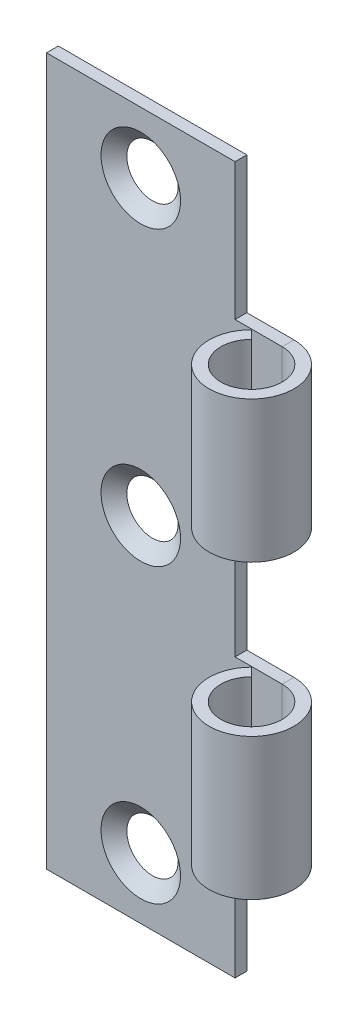
ISO-10303-21;
HEADER;
FILE_DESCRIPTION(('STEP AP214'),'2;1');
FILE_NAME('part.step','',(''),(''),'','','');
FILE_SCHEMA(('AUTOMOTIVE_DESIGN { 1 0 10303 214 1 1 1 1 }'));
ENDSEC;
DATA;
#1=APPLICATION_CONTEXT('core data for automotive mechanical design processes');
#2=APPLICATION_PROTOCOL_DEFINITION('international standard','automotive_design',2000,#1);
#3=PRODUCT_CONTEXT('',#1,'mechanical');
#4=PRODUCT('Part','Part','',(#3));
#5=PRODUCT_RELATED_PRODUCT_CATEGORY('part','',(#4));
#6=PRODUCT_DEFINITION_FORMATION('','',#4);
#7=PRODUCT_DEFINITION_CONTEXT('part definition',#1,'design');
#8=PRODUCT_DEFINITION('design','',#6,#7);
#9=PRODUCT_DEFINITION_SHAPE('','',#8);
#10=(LENGTH_UNIT() NAMED_UNIT(*) SI_UNIT(.MILLI.,.METRE.));
#11=(NAMED_UNIT(*) PLANE_ANGLE_UNIT() SI_UNIT($,.RADIAN.));
#12=(NAMED_UNIT(*) SI_UNIT($,.STERADIAN.) SOLID_ANGLE_UNIT());
#13=UNCERTAINTY_MEASURE_WITH_UNIT(LENGTH_MEASURE(1.E-05),#10,'distance_accuracy_value','');
#14=(GEOMETRIC_REPRESENTATION_CONTEXT(3) GLOBAL_UNCERTAINTY_ASSIGNED_CONTEXT((#13)) GLOBAL_UNIT_ASSIGNED_CONTEXT((#10,
#11,#12)) REPRESENTATION_CONTEXT('',''));
#15=CARTESIAN_POINT('',(0.,0.,0.));
#16=DIRECTION('',(0.,0.,1.));
#17=DIRECTION('',(1.,0.,0.));
#18=AXIS2_PLACEMENT_3D('',#15,#16,#17);
#19=CARTESIAN_POINT('',(0.,0.,-0.625));
#20=DIRECTION('',(0.,0.,1.));
#21=DIRECTION('',(1.,0.,0.));
#22=AXIS2_PLACEMENT_3D('',#19,#20,#21);
#23=PLANE('',#22);
#24=CARTESIAN_POINT('',(-15.,31.,-0.625));
#25=DIRECTION('',(0.,0.,1.));
#26=DIRECTION('',(1.,0.,0.));
#27=AXIS2_PLACEMENT_3D('',#24,#25,#26);
#28=CIRCLE('',#27,2.72670800925724);
#29=CARTESIAN_POINT('',(-12.2732919907428,31.,-0.625));
#30=VERTEX_POINT('',#29);
#31=EDGE_CURVE('E546',#30,#30,#28,.T.);
#32=ORIENTED_EDGE('',*,*,#31,.T.);
#33=EDGE_LOOP('',(#32));
#34=FACE_BOUND('',#33,.T.);
#35=CARTESIAN_POINT('',(-15.,0.,-0.625));
#36=DIRECTION('',(0.,0.,1.));
#37=DIRECTION('',(1.,0.,0.));
#38=AXIS2_PLACEMENT_3D('',#35,#36,#37);
#39=CIRCLE('',#38,2.72670800925724);
#40=CARTESIAN_POINT('',(-12.2732919907428,0.,-0.625));
#41=VERTEX_POINT('',#40);
#42=EDGE_CURVE('E47',#41,#41,#39,.T.);
#43=ORIENTED_EDGE('',*,*,#42,.T.);
#44=EDGE_LOOP('',(#43));
#45=FACE_BOUND('',#44,.T.);
#46=CARTESIAN_POINT('',(-15.,-31.,-0.625));
#47=DIRECTION('',(0.,0.,1.));
#48=DIRECTION('',(1.,0.,0.));
#49=AXIS2_PLACEMENT_3D('',#46,#47,#48);
#50=CIRCLE('',#49,2.72670800925724);
#51=CARTESIAN_POINT('',(-12.2732919907428,-31.,-0.625));
#52=VERTEX_POINT('',#51);
#53=EDGE_CURVE('E262',#52,#52,#50,.T.);
#54=ORIENTED_EDGE('',*,*,#53,.T.);
#55=EDGE_LOOP('',(#54));
#56=FACE_BOUND('',#55,.T.);
#57=DIRECTION('',(0.,-1.,0.));
#58=VECTOR('',#57,1.);
#59=CARTESIAN_POINT('',(-25.,-37.5,-0.625));
#60=LINE('',#59,#58);
#61=CARTESIAN_POINT('',(-25.,37.5,-0.625));
#62=VERTEX_POINT('',#61);
#63=CARTESIAN_POINT('',(-25.,-37.5,-0.625));
#64=VERTEX_POINT('',#63);
#65=EDGE_CURVE('E196',#62,#64,#60,.T.);
#66=ORIENTED_EDGE('',*,*,#65,.F.);
#67=DIRECTION('',(-1.,0.,0.));
#68=VECTOR('',#67,1.);
#69=CARTESIAN_POINT('',(-5.,37.5,-0.625));
#70=LINE('',#69,#68);
#71=CARTESIAN_POINT('',(-5.,37.5,-0.625));
#72=VERTEX_POINT('',#71);
#73=EDGE_CURVE('E152',#72,#62,#70,.T.);
#74=ORIENTED_EDGE('',*,*,#73,.F.);
#75=DIRECTION('',(0.,1.,0.));
#76=VECTOR('',#75,1.);
#77=CARTESIAN_POINT('',(-4.99999999999997,24.5,-0.625));
#78=LINE('',#77,#76);
#79=CARTESIAN_POINT('',(-4.99999999999997,23.,-0.625));
#80=VERTEX_POINT('',#79);
#81=EDGE_CURVE('E139',#80,#72,#78,.T.);
#82=ORIENTED_EDGE('',*,*,#81,.F.);
#83=DIRECTION('',(-1.,0.,0.));
#84=VECTOR('',#83,1.);
#85=CARTESIAN_POINT('',(0.,23.,-0.625));
#86=LINE('',#85,#84);
#87=CARTESIAN_POINT('',(0.,23.,-0.625));
#88=VERTEX_POINT('',#87);
#89=EDGE_CURVE('E150',#88,#80,#86,.T.);
#90=ORIENTED_EDGE('',*,*,#89,.F.);
#91=DIRECTION('',(0.,1.,0.));
#92=VECTOR('',#91,1.);
#93=CARTESIAN_POINT('',(0.,8.,-0.625));
#94=LINE('',#93,#92);
#95=CARTESIAN_POINT('',(0.,8.,-0.625));
#96=VERTEX_POINT('',#95);
#97=EDGE_CURVE('E156',#96,#88,#94,.T.);
#98=ORIENTED_EDGE('',*,*,#97,.F.);
#99=DIRECTION('',(1.,0.,0.));
#100=VECTOR('',#99,1.);
#101=CARTESIAN_POINT('',(-4.99999999999989,8.,-0.625));
#102=LINE('',#101,#100);
#103=CARTESIAN_POINT('',(-4.99999999999989,8.,-0.625));
#104=VERTEX_POINT('',#103);
#105=EDGE_CURVE('E158',#104,#96,#102,.T.);
#106=ORIENTED_EDGE('',*,*,#105,.F.);
#107=DIRECTION('',(0.,1.,0.));
#108=VECTOR('',#107,1.);
#109=CARTESIAN_POINT('',(-4.99999999999993,-6.5,-0.625));
#110=LINE('',#109,#108);
#111=CARTESIAN_POINT('',(-4.99999999999993,-8.,-0.625));
#112=VERTEX_POINT('',#111);
#113=EDGE_CURVE('E331',#112,#104,#110,.T.);
#114=ORIENTED_EDGE('',*,*,#113,.F.);
#115=DIRECTION('',(-1.,0.,0.));
#116=VECTOR('',#115,1.);
#117=CARTESIAN_POINT('',(0.,-8.,-0.625));
#118=LINE('',#117,#116);
#119=CARTESIAN_POINT('',(0.,-8.,-0.625));
#120=VERTEX_POINT('',#119);
#121=EDGE_CURVE('E328',#120,#112,#118,.T.);
#122=ORIENTED_EDGE('',*,*,#121,.F.);
#123=DIRECTION('',(0.,1.,0.));
#124=VECTOR('',#123,1.);
#125=CARTESIAN_POINT('',(0.,-23.,-0.625));
#126=LINE('',#125,#124);
#127=CARTESIAN_POINT('',(0.,-23.,-0.625));
#128=VERTEX_POINT('',#127);
#129=EDGE_CURVE('E325',#128,#120,#126,.T.);
#130=ORIENTED_EDGE('',*,*,#129,.F.);
#131=DIRECTION('',(1.,0.,0.));
#132=VECTOR('',#131,1.);
#133=CARTESIAN_POINT('',(-5.,-23.,-0.625));
#134=LINE('',#133,#132);
#135=CARTESIAN_POINT('',(-5.,-23.,-0.625));
#136=VERTEX_POINT('',#135);
#137=EDGE_CURVE('E322',#136,#128,#134,.T.);
#138=ORIENTED_EDGE('',*,*,#137,.F.);
#139=DIRECTION('',(0.,1.,0.));
#140=VECTOR('',#139,1.);
#141=CARTESIAN_POINT('',(-4.99999999999997,-37.5,-0.625));
#142=LINE('',#141,#140);
#143=CARTESIAN_POINT('',(-4.99999999999997,-37.5,-0.625));
#144=VERTEX_POINT('',#143);
#145=EDGE_CURVE('E320',#144,#136,#142,.T.);
#146=ORIENTED_EDGE('',*,*,#145,.F.);
#147=DIRECTION('',(1.,0.,0.));
#148=VECTOR('',#147,1.);
#149=CARTESIAN_POINT('',(-4.99999999999997,-37.5,-0.625));
#150=LINE('',#149,#148);
#151=EDGE_CURVE('E318',#64,#144,#150,.T.);
#152=ORIENTED_EDGE('',*,*,#151,.F.);
#153=EDGE_LOOP('',(#66,#74,#82,#90,#98,#106,#114,#122,#130,#138,#146,#152));
#154=FACE_BOUND('',#153,.T.);
#155=ADVANCED_FACE('F43',(#34,#45,#56,#154),#23,.F.);
#156=CARTESIAN_POINT('',(-25.,-37.5,-0.625));
#157=DIRECTION('',(-1.,0.,0.));
#158=DIRECTION('',(0.,0.,1.));
#159=AXIS2_PLACEMENT_3D('',#156,#157,#158);
#160=PLANE('',#159);
#161=DIRECTION('',(0.,-1.,0.));
#162=VECTOR('',#161,1.);
#163=CARTESIAN_POINT('',(-25.,-37.5,0.625));
#164=LINE('',#163,#162);
#165=CARTESIAN_POINT('',(-25.,37.5,0.625));
#166=VERTEX_POINT('',#165);
#167=CARTESIAN_POINT('',(-25.,-37.5,0.625));
#168=VERTEX_POINT('',#167);
#169=EDGE_CURVE('E163',#166,#168,#164,.T.);
#170=ORIENTED_EDGE('',*,*,#169,.F.);
#171=DIRECTION('',(0.,0.,1.));
#172=VECTOR('',#171,1.);
#173=CARTESIAN_POINT('',(-25.,37.5,-0.625));
#174=LINE('',#173,#172);
#175=EDGE_CURVE('E11',#62,#166,#174,.T.);
#176=ORIENTED_EDGE('',*,*,#175,.F.);
#177=ORIENTED_EDGE('',*,*,#65,.T.);
#178=DIRECTION('',(0.,0.,1.));
#179=VECTOR('',#178,1.);
#180=CARTESIAN_POINT('',(-25.,-37.5,-0.625));
#181=LINE('',#180,#179);
#182=EDGE_CURVE('E106',#64,#168,#181,.T.);
#183=ORIENTED_EDGE('',*,*,#182,.T.);
#184=EDGE_LOOP('',(#170,#176,#177,#183));
#185=FACE_BOUND('',#184,.T.);
#186=ADVANCED_FACE('F45',(#185),#160,.T.);
#187=CARTESIAN_POINT('',(-5.,37.5,-0.625));
#188=DIRECTION('',(0.,1.,0.));
#189=DIRECTION('',(-1.,0.,0.));
#190=AXIS2_PLACEMENT_3D('',#187,#188,#189);
#191=PLANE('',#190);
#192=DIRECTION('',(-1.,0.,0.));
#193=VECTOR('',#192,1.);
#194=CARTESIAN_POINT('',(-5.,37.5,0.625));
#195=LINE('',#194,#193);
#196=CARTESIAN_POINT('',(-5.,37.5,0.625));
#197=VERTEX_POINT('',#196);
#198=EDGE_CURVE('E194',#197,#166,#195,.T.);
#199=ORIENTED_EDGE('',*,*,#198,.F.);
#200=DIRECTION('',(0.,0.,1.));
#201=VECTOR('',#200,1.);
#202=CARTESIAN_POINT('',(-5.,37.5,-0.625));
#203=LINE('',#202,#201);
#204=EDGE_CURVE('E53',#72,#197,#203,.T.);
#205=ORIENTED_EDGE('',*,*,#204,.F.);
#206=ORIENTED_EDGE('',*,*,#73,.T.);
#207=ORIENTED_EDGE('',*,*,#175,.T.);
#208=EDGE_LOOP('',(#199,#205,#206,#207));
#209=FACE_BOUND('',#208,.T.);
#210=ADVANCED_FACE('F219',(#209),#191,.T.);
#211=CARTESIAN_POINT('',(-4.99999999999997,24.5,-0.625));
#212=DIRECTION('',(1.,0.,0.));
#213=DIRECTION('',(0.,1.,0.));
#214=AXIS2_PLACEMENT_3D('',#211,#212,#213);
#215=PLANE('',#214);
#216=DIRECTION('',(0.,1.,0.));
#217=VECTOR('',#216,1.);
#218=CARTESIAN_POINT('',(-4.99999999999997,24.5,0.625));
#219=LINE('',#218,#217);
#220=CARTESIAN_POINT('',(-4.99999999999997,23.,0.625));
#221=VERTEX_POINT('',#220);
#222=EDGE_CURVE('E140',#221,#197,#219,.T.);
#223=ORIENTED_EDGE('',*,*,#222,.F.);
#224=DIRECTION('',(0.,0.,1.));
#225=VECTOR('',#224,1.);
#226=CARTESIAN_POINT('',(-4.99999999999997,23.,-0.625));
#227=LINE('',#226,#225);
#228=EDGE_CURVE('E136',#80,#221,#227,.T.);
#229=ORIENTED_EDGE('',*,*,#228,.F.);
#230=ORIENTED_EDGE('',*,*,#81,.T.);
#231=ORIENTED_EDGE('',*,*,#204,.T.);
#232=EDGE_LOOP('',(#223,#229,#230,#231));
#233=FACE_BOUND('',#232,.T.);
#234=ADVANCED_FACE('F138',(#233),#215,.T.);
#235=CARTESIAN_POINT('',(0.,23.,-0.625));
#236=DIRECTION('',(0.,1.,0.));
#237=DIRECTION('',(-1.,0.,0.));
#238=AXIS2_PLACEMENT_3D('',#235,#236,#237);
#239=PLANE('',#238);
#240=DIRECTION('',(-1.,0.,0.));
#241=VECTOR('',#240,1.);
#242=CARTESIAN_POINT('',(0.,23.,0.625));
#243=LINE('',#242,#241);
#244=CARTESIAN_POINT('',(0.,23.,0.625000000000001));
#245=VERTEX_POINT('',#244);
#246=EDGE_CURVE('E191',#245,#221,#243,.T.);
#247=ORIENTED_EDGE('',*,*,#246,.F.);
#248=DIRECTION('',(0.,0.,1.));
#249=VECTOR('',#248,1.);
#250=CARTESIAN_POINT('',(0.,23.,-0.625));
#251=LINE('',#250,#249);
#252=EDGE_CURVE('E145',#88,#245,#251,.T.);
#253=ORIENTED_EDGE('',*,*,#252,.F.);
#254=ORIENTED_EDGE('',*,*,#89,.T.);
#255=ORIENTED_EDGE('',*,*,#228,.T.);
#256=EDGE_LOOP('',(#247,#253,#254,#255));
#257=FACE_BOUND('',#256,.T.);
#258=ADVANCED_FACE('F154',(#257),#239,.T.);
#259=CARTESIAN_POINT('',(-4.99999999999989,8.,-0.625));
#260=DIRECTION('',(0.,-1.,0.));
#261=DIRECTION('',(1.,0.,0.));
#262=AXIS2_PLACEMENT_3D('',#259,#260,#261);
#263=PLANE('',#262);
#264=DIRECTION('',(1.,0.,0.));
#265=VECTOR('',#264,1.);
#266=CARTESIAN_POINT('',(-4.99999999999989,8.,0.625));
#267=LINE('',#266,#265);
#268=CARTESIAN_POINT('',(-4.99999999999989,8.,0.625));
#269=VERTEX_POINT('',#268);
#270=CARTESIAN_POINT('',(0.,8.,0.625));
#271=VERTEX_POINT('',#270);
#272=EDGE_CURVE('E185',#269,#271,#267,.T.);
#273=ORIENTED_EDGE('',*,*,#272,.F.);
#274=DIRECTION('',(0.,0.,1.));
#275=VECTOR('',#274,1.);
#276=CARTESIAN_POINT('',(-4.99999999999989,8.,-0.625));
#277=LINE('',#276,#275);
#278=EDGE_CURVE('E202',#104,#269,#277,.T.);
#279=ORIENTED_EDGE('',*,*,#278,.F.);
#280=ORIENTED_EDGE('',*,*,#105,.T.);
#281=DIRECTION('',(0.,0.,1.));
#282=VECTOR('',#281,1.);
#283=CARTESIAN_POINT('',(0.,8.,-0.625));
#284=LINE('',#283,#282);
#285=EDGE_CURVE('E200',#96,#271,#284,.T.);
#286=ORIENTED_EDGE('',*,*,#285,.T.);
#287=EDGE_LOOP('',(#273,#279,#280,#286));
#288=FACE_BOUND('',#287,.T.);
#289=ADVANCED_FACE('F338',(#288),#263,.T.);
#290=CARTESIAN_POINT('',(-4.99999999999989,8.,-0.625));
#291=DIRECTION('',(1.,0.,0.));
#292=DIRECTION('',(0.,0.,-1.));
#293=AXIS2_PLACEMENT_3D('',#290,#291,#292);
#294=PLANE('',#293);
#295=DIRECTION('',(0.,1.,0.));
#296=VECTOR('',#295,1.);
#297=CARTESIAN_POINT('',(-4.99999999999989,8.,0.625));
#298=LINE('',#297,#296);
#299=CARTESIAN_POINT('',(-4.99999999999993,-8.,0.625));
#300=VERTEX_POINT('',#299);
#301=EDGE_CURVE('E182',#300,#269,#298,.T.);
#302=ORIENTED_EDGE('',*,*,#301,.F.);
#303=DIRECTION('',(0.,0.,1.));
#304=VECTOR('',#303,1.);
#305=CARTESIAN_POINT('',(-4.99999999999993,-8.,-0.625));
#306=LINE('',#305,#304);
#307=EDGE_CURVE('E204',#112,#300,#306,.T.);
#308=ORIENTED_EDGE('',*,*,#307,.F.);
#309=ORIENTED_EDGE('',*,*,#113,.T.);
#310=ORIENTED_EDGE('',*,*,#278,.T.);
#311=EDGE_LOOP('',(#302,#308,#309,#310));
#312=FACE_BOUND('',#311,.T.);
#313=ADVANCED_FACE('F409',(#312),#294,.T.);
#314=CARTESIAN_POINT('',(0.,-8.,-0.625));
#315=DIRECTION('',(0.,1.,0.));
#316=DIRECTION('',(0.,0.,1.));
#317=AXIS2_PLACEMENT_3D('',#314,#315,#316);
#318=PLANE('',#317);
#319=DIRECTION('',(-1.,0.,0.));
#320=VECTOR('',#319,1.);
#321=CARTESIAN_POINT('',(0.,-8.,0.625));
#322=LINE('',#321,#320);
#323=CARTESIAN_POINT('',(0.,-8.,0.625));
#324=VERTEX_POINT('',#323);
#325=EDGE_CURVE('E179',#324,#300,#322,.T.);
#326=ORIENTED_EDGE('',*,*,#325,.F.);
#327=DIRECTION('',(0.,0.,1.));
#328=VECTOR('',#327,1.);
#329=CARTESIAN_POINT('',(0.,-8.,-0.625));
#330=LINE('',#329,#328);
#331=EDGE_CURVE('E207',#120,#324,#330,.T.);
#332=ORIENTED_EDGE('',*,*,#331,.F.);
#333=ORIENTED_EDGE('',*,*,#121,.T.);
#334=ORIENTED_EDGE('',*,*,#307,.T.);
#335=EDGE_LOOP('',(#326,#332,#333,#334));
#336=FACE_BOUND('',#335,.T.);
#337=ADVANCED_FACE('F385',(#336),#318,.T.);
#338=CARTESIAN_POINT('',(-5.,-23.,-0.625));
#339=DIRECTION('',(0.,-1.,0.));
#340=DIRECTION('',(0.,0.,-1.));
#341=AXIS2_PLACEMENT_3D('',#338,#339,#340);
#342=PLANE('',#341);
#343=DIRECTION('',(1.,0.,0.));
#344=VECTOR('',#343,1.);
#345=CARTESIAN_POINT('',(-5.,-23.,0.625));
#346=LINE('',#345,#344);
#347=CARTESIAN_POINT('',(-5.,-23.,0.625));
#348=VERTEX_POINT('',#347);
#349=CARTESIAN_POINT('',(0.,-23.,0.625));
#350=VERTEX_POINT('',#349);
#351=EDGE_CURVE('E173',#348,#350,#346,.T.);
#352=ORIENTED_EDGE('',*,*,#351,.F.);
#353=DIRECTION('',(0.,0.,1.));
#354=VECTOR('',#353,1.);
#355=CARTESIAN_POINT('',(-5.,-23.,-0.625));
#356=LINE('',#355,#354);
#357=EDGE_CURVE('E212',#136,#348,#356,.T.);
#358=ORIENTED_EDGE('',*,*,#357,.F.);
#359=ORIENTED_EDGE('',*,*,#137,.T.);
#360=DIRECTION('',(0.,0.,1.));
#361=VECTOR('',#360,1.);
#362=CARTESIAN_POINT('',(0.,-23.,-0.625));
#363=LINE('',#362,#361);
#364=EDGE_CURVE('E210',#128,#350,#363,.T.);
#365=ORIENTED_EDGE('',*,*,#364,.T.);
#366=EDGE_LOOP('',(#352,#358,#359,#365));
#367=FACE_BOUND('',#366,.T.);
#368=ADVANCED_FACE('F395',(#367),#342,.T.);
#369=CARTESIAN_POINT('',(-5.,-23.,-0.625));
#370=DIRECTION('',(1.,0.,0.));
#371=DIRECTION('',(0.,0.,-1.));
#372=AXIS2_PLACEMENT_3D('',#369,#370,#371);
#373=PLANE('',#372);
#374=DIRECTION('',(0.,1.,0.));
#375=VECTOR('',#374,1.);
#376=CARTESIAN_POINT('',(-5.,-23.,0.625));
#377=LINE('',#376,#375);
#378=CARTESIAN_POINT('',(-4.99999999999997,-37.5,0.625));
#379=VERTEX_POINT('',#378);
#380=EDGE_CURVE('E170',#379,#348,#377,.T.);
#381=ORIENTED_EDGE('',*,*,#380,.F.);
#382=DIRECTION('',(0.,0.,1.));
#383=VECTOR('',#382,1.);
#384=CARTESIAN_POINT('',(-4.99999999999997,-37.5,-0.625));
#385=LINE('',#384,#383);
#386=EDGE_CURVE('E214',#144,#379,#385,.T.);
#387=ORIENTED_EDGE('',*,*,#386,.F.);
#388=ORIENTED_EDGE('',*,*,#145,.T.);
#389=ORIENTED_EDGE('',*,*,#357,.T.);
#390=EDGE_LOOP('',(#381,#387,#388,#389));
#391=FACE_BOUND('',#390,.T.);
#392=ADVANCED_FACE('F249',(#391),#373,.T.);
#393=CARTESIAN_POINT('',(-4.99999999999997,-37.5,-0.625));
#394=DIRECTION('',(0.,-1.,0.));
#395=DIRECTION('',(1.,0.,0.));
#396=AXIS2_PLACEMENT_3D('',#393,#394,#395);
#397=PLANE('',#396);
#398=DIRECTION('',(1.,0.,0.));
#399=VECTOR('',#398,1.);
#400=CARTESIAN_POINT('',(-4.99999999999997,-37.5,0.625));
#401=LINE('',#400,#399);
#402=EDGE_CURVE('E166',#168,#379,#401,.T.);
#403=ORIENTED_EDGE('',*,*,#402,.F.);
#404=ORIENTED_EDGE('',*,*,#182,.F.);
#405=ORIENTED_EDGE('',*,*,#151,.T.);
#406=ORIENTED_EDGE('',*,*,#386,.T.);
#407=EDGE_LOOP('',(#403,#404,#405,#406));
#408=FACE_BOUND('',#407,.T.);
#409=ADVANCED_FACE('F216',(#408),#397,.T.);
#410=CARTESIAN_POINT('',(0.,0.,0.625));
#411=DIRECTION('',(0.,0.,1.));
#412=DIRECTION('',(1.,0.,0.));
#413=AXIS2_PLACEMENT_3D('',#410,#411,#412);
#414=PLANE('',#413);
#415=CARTESIAN_POINT('',(-15.,31.,0.625));
#416=DIRECTION('',(0.,0.,1.));
#417=DIRECTION('',(1.,0.,0.));
#418=AXIS2_PLACEMENT_3D('',#415,#416,#417);
#419=CIRCLE('',#418,4.2164);
#420=CARTESIAN_POINT('',(-10.7836,31.,0.625));
#421=VERTEX_POINT('',#420);
#422=EDGE_CURVE('E253',#421,#421,#419,.T.);
#423=ORIENTED_EDGE('',*,*,#422,.F.);
#424=EDGE_LOOP('',(#423));
#425=FACE_BOUND('',#424,.T.);
#426=CARTESIAN_POINT('',(-15.,0.,0.625));
#427=DIRECTION('',(0.,0.,1.));
#428=DIRECTION('',(1.,0.,0.));
#429=AXIS2_PLACEMENT_3D('',#426,#427,#428);
#430=CIRCLE('',#429,4.2164);
#431=CARTESIAN_POINT('',(-10.7836,0.,0.625));
#432=VERTEX_POINT('',#431);
#433=EDGE_CURVE('E257',#432,#432,#430,.T.);
#434=ORIENTED_EDGE('',*,*,#433,.F.);
#435=EDGE_LOOP('',(#434));
#436=FACE_BOUND('',#435,.T.);
#437=CARTESIAN_POINT('',(-15.,-31.,0.625));
#438=DIRECTION('',(0.,0.,1.));
#439=DIRECTION('',(1.,0.,0.));
#440=AXIS2_PLACEMENT_3D('',#437,#438,#439);
#441=CIRCLE('',#440,4.2164);
#442=CARTESIAN_POINT('',(-10.7836,-31.,0.625));
#443=VERTEX_POINT('',#442);
#444=EDGE_CURVE('E260',#443,#443,#441,.T.);
#445=ORIENTED_EDGE('',*,*,#444,.F.);
#446=EDGE_LOOP('',(#445));
#447=FACE_BOUND('',#446,.T.);
#448=ORIENTED_EDGE('',*,*,#169,.T.);
#449=ORIENTED_EDGE('',*,*,#402,.T.);
#450=ORIENTED_EDGE('',*,*,#380,.T.);
#451=ORIENTED_EDGE('',*,*,#351,.T.);
#452=DIRECTION('',(0.,1.,0.));
#453=VECTOR('',#452,1.);
#454=CARTESIAN_POINT('',(0.,-23.,0.625));
#455=LINE('',#454,#453);
#456=EDGE_CURVE('E176',#350,#324,#455,.T.);
#457=ORIENTED_EDGE('',*,*,#456,.T.);
#458=ORIENTED_EDGE('',*,*,#325,.T.);
#459=ORIENTED_EDGE('',*,*,#301,.T.);
#460=ORIENTED_EDGE('',*,*,#272,.T.);
#461=DIRECTION('',(0.,1.,0.));
#462=VECTOR('',#461,1.);
#463=CARTESIAN_POINT('',(0.,8.,0.625));
#464=LINE('',#463,#462);
#465=EDGE_CURVE('E188',#271,#245,#464,.T.);
#466=ORIENTED_EDGE('',*,*,#465,.T.);
#467=ORIENTED_EDGE('',*,*,#246,.T.);
#468=ORIENTED_EDGE('',*,*,#222,.T.);
#469=ORIENTED_EDGE('',*,*,#198,.T.);
#470=EDGE_LOOP('',(#448,#449,#450,#451,#457,#458,#459,#460,#466,#467,#468,#469));
#471=FACE_BOUND('',#470,.T.);
#472=ADVANCED_FACE('F218',(#425,#436,#447,#471),#414,.T.);
#473=CARTESIAN_POINT('',(-2.29809703885625,15.5,1.57690296114369));
#474=DIRECTION('',(-0.707106781186556,0.,0.707106781186539));
#475=DIRECTION('',(0.,1.,0.));
#476=AXIS2_PLACEMENT_3D('',#473,#474,#475);
#477=PLANE('',#476);
#478=DIRECTION('',(-0.707106781186539,0.,-0.707106781186556));
#479=VECTOR('',#478,1.);
#480=CARTESIAN_POINT('',(-2.29809703885624,23.,1.57690296114369));
#481=LINE('',#480,#479);
#482=CARTESIAN_POINT('',(-2.29809703885624,23.,1.57690296114369));
#483=VERTEX_POINT('',#482);
#484=CARTESIAN_POINT('',(-3.18198051533942,23.,0.693019484660496));
#485=VERTEX_POINT('',#484);
#486=EDGE_CURVE('E167',#483,#485,#481,.T.);
#487=ORIENTED_EDGE('',*,*,#486,.F.);
#488=DIRECTION('',(0.,1.,0.));
#489=VECTOR('',#488,1.);
#490=CARTESIAN_POINT('',(-2.29809703885624,23.,1.57690296114369));
#491=LINE('',#490,#489);
#492=CARTESIAN_POINT('',(-2.29809703885625,8.,1.57690296114369));
#493=VERTEX_POINT('',#492);
#494=EDGE_CURVE('E294',#493,#483,#491,.T.);
#495=ORIENTED_EDGE('',*,*,#494,.F.);
#496=DIRECTION('',(-0.707106781186539,0.,-0.707106781186556));
#497=VECTOR('',#496,1.);
#498=CARTESIAN_POINT('',(-2.29809703885625,8.,1.57690296114369));
#499=LINE('',#498,#497);
#500=CARTESIAN_POINT('',(-3.18198051533943,8.,0.693019484660494));
#501=VERTEX_POINT('',#500);
#502=EDGE_CURVE('E298',#493,#501,#499,.T.);
#503=ORIENTED_EDGE('',*,*,#502,.T.);
#504=DIRECTION('',(0.,1.,0.));
#505=VECTOR('',#504,1.);
#506=CARTESIAN_POINT('',(-3.18198051533942,23.,0.693019484660496));
#507=LINE('',#506,#505);
#508=EDGE_CURVE('E300',#501,#485,#507,.T.);
#509=ORIENTED_EDGE('',*,*,#508,.T.);
#510=EDGE_LOOP('',(#487,#495,#503,#509));
#511=FACE_BOUND('',#510,.T.);
#512=ADVANCED_FACE('F240',(#511),#477,.F.);
#513=CARTESIAN_POINT('',(0.,8.,3.87499999999999));
#514=DIRECTION('',(0.,-1.,0.));
#515=DIRECTION('',(1.,0.,0.));
#516=AXIS2_PLACEMENT_3D('',#513,#514,#515);
#517=PLANE('',#516);
#518=ORIENTED_EDGE('',*,*,#502,.F.);
#519=CARTESIAN_POINT('',(0.,8.,3.87499999999999));
#520=DIRECTION('',(0.,1.,0.));
#521=DIRECTION('',(-1.,0.,0.));
#522=AXIS2_PLACEMENT_3D('',#519,#520,#521);
#523=CIRCLE('',#522,3.25);
#524=EDGE_CURVE('E303',#271,#493,#523,.F.);
#525=ORIENTED_EDGE('',*,*,#524,.F.);
#526=ORIENTED_EDGE('',*,*,#285,.F.);
#527=CARTESIAN_POINT('',(0.,8.,3.87499999999999));
#528=DIRECTION('',(0.,1.,0.));
#529=DIRECTION('',(-1.,0.,0.));
#530=AXIS2_PLACEMENT_3D('',#527,#528,#529);
#531=CIRCLE('',#530,4.5);
#532=EDGE_CURVE('E295',#96,#501,#531,.F.);
#533=ORIENTED_EDGE('',*,*,#532,.T.);
#534=EDGE_LOOP('',(#518,#525,#526,#533));
#535=FACE_BOUND('',#534,.T.);
#536=ADVANCED_FACE('F246',(#535),#517,.T.);
#537=CARTESIAN_POINT('',(0.,23.,3.875));
#538=DIRECTION('',(0.,-1.,0.));
#539=DIRECTION('',(1.,0.,0.));
#540=AXIS2_PLACEMENT_3D('',#537,#538,#539);
#541=PLANE('',#540);
#542=CARTESIAN_POINT('',(0.,23.,3.875));
#543=DIRECTION('',(0.,1.,0.));
#544=DIRECTION('',(-1.,0.,0.));
#545=AXIS2_PLACEMENT_3D('',#542,#543,#544);
#546=CIRCLE('',#545,3.25);
#547=EDGE_CURVE('E308',#483,#245,#546,.T.);
#548=ORIENTED_EDGE('',*,*,#547,.F.);
#549=ORIENTED_EDGE('',*,*,#486,.T.);
#550=CARTESIAN_POINT('',(0.,23.,3.875));
#551=DIRECTION('',(0.,1.,0.));
#552=DIRECTION('',(-1.,0.,0.));
#553=AXIS2_PLACEMENT_3D('',#550,#551,#552);
#554=CIRCLE('',#553,4.5);
#555=EDGE_CURVE('E299',#485,#88,#554,.T.);
#556=ORIENTED_EDGE('',*,*,#555,.T.);
#557=ORIENTED_EDGE('',*,*,#252,.T.);
#558=EDGE_LOOP('',(#548,#549,#556,#557));
#559=FACE_BOUND('',#558,.T.);
#560=ADVANCED_FACE('F238',(#559),#541,.F.);
#561=CARTESIAN_POINT('',(0.,23.,3.875));
#562=DIRECTION('',(0.,1.,0.));
#563=DIRECTION('',(-0.707106781186539,0.,-0.707106781186556));
#564=AXIS2_PLACEMENT_3D('',#561,#562,#563);
#565=CYLINDRICAL_SURFACE('',#564,4.5);
#566=ORIENTED_EDGE('',*,*,#97,.T.);
#567=ORIENTED_EDGE('',*,*,#555,.F.);
#568=ORIENTED_EDGE('',*,*,#508,.F.);
#569=ORIENTED_EDGE('',*,*,#532,.F.);
#570=EDGE_LOOP('',(#566,#567,#568,#569));
#571=FACE_BOUND('',#570,.T.);
#572=ADVANCED_FACE('F347',(#571),#565,.T.);
#573=CARTESIAN_POINT('',(0.,23.,3.875));
#574=DIRECTION('',(0.,1.,0.));
#575=DIRECTION('',(-0.707106781186539,0.,-0.707106781186556));
#576=AXIS2_PLACEMENT_3D('',#573,#574,#575);
#577=CYLINDRICAL_SURFACE('',#576,3.25);
#578=ORIENTED_EDGE('',*,*,#465,.F.);
#579=ORIENTED_EDGE('',*,*,#524,.T.);
#580=ORIENTED_EDGE('',*,*,#494,.T.);
#581=ORIENTED_EDGE('',*,*,#547,.T.);
#582=EDGE_LOOP('',(#578,#579,#580,#581));
#583=FACE_BOUND('',#582,.T.);
#584=ADVANCED_FACE('F463',(#583),#577,.F.);
#585=CARTESIAN_POINT('',(-2.29809703885625,-15.5,1.57690296114369));
#586=DIRECTION('',(-0.707106781186556,0.,0.707106781186539));
#587=DIRECTION('',(0.,1.,0.));
#588=AXIS2_PLACEMENT_3D('',#585,#586,#587);
#589=PLANE('',#588);
#590=DIRECTION('',(-0.707106781186539,0.,-0.707106781186556));
#591=VECTOR('',#590,1.);
#592=CARTESIAN_POINT('',(-2.29809703885625,-8.,1.57690296114369));
#593=LINE('',#592,#591);
#594=CARTESIAN_POINT('',(-2.29809703885625,-8.,1.57690296114369));
#595=VERTEX_POINT('',#594);
#596=CARTESIAN_POINT('',(-3.18198051533943,-8.,0.693019484660497));
#597=VERTEX_POINT('',#596);
#598=EDGE_CURVE('E291',#595,#597,#593,.T.);
#599=ORIENTED_EDGE('',*,*,#598,.F.);
#600=DIRECTION('',(0.,1.,0.));
#601=VECTOR('',#600,1.);
#602=CARTESIAN_POINT('',(-2.29809703885625,-8.,1.57690296114369));
#603=LINE('',#602,#601);
#604=CARTESIAN_POINT('',(-2.29809703885625,-23.,1.57690296114369));
#605=VERTEX_POINT('',#604);
#606=EDGE_CURVE('E265',#605,#595,#603,.T.);
#607=ORIENTED_EDGE('',*,*,#606,.F.);
#608=DIRECTION('',(-0.707106781186539,0.,-0.707106781186556));
#609=VECTOR('',#608,1.);
#610=CARTESIAN_POINT('',(-2.29809703885625,-23.,1.57690296114369));
#611=LINE('',#610,#609);
#612=CARTESIAN_POINT('',(-3.18198051533943,-23.,0.693019484660497));
#613=VERTEX_POINT('',#612);
#614=EDGE_CURVE('E274',#605,#613,#611,.T.);
#615=ORIENTED_EDGE('',*,*,#614,.T.);
#616=DIRECTION('',(0.,1.,0.));
#617=VECTOR('',#616,1.);
#618=CARTESIAN_POINT('',(-3.18198051533943,-8.,0.693019484660497));
#619=LINE('',#618,#617);
#620=EDGE_CURVE('E276',#613,#597,#619,.T.);
#621=ORIENTED_EDGE('',*,*,#620,.T.);
#622=EDGE_LOOP('',(#599,#607,#615,#621));
#623=FACE_BOUND('',#622,.T.);
#624=ADVANCED_FACE('F375',(#623),#589,.F.);
#625=CARTESIAN_POINT('',(0.,-23.,3.875));
#626=DIRECTION('',(0.,-1.,0.));
#627=DIRECTION('',(0.,0.,-1.));
#628=AXIS2_PLACEMENT_3D('',#625,#626,#627);
#629=PLANE('',#628);
#630=ORIENTED_EDGE('',*,*,#614,.F.);
#631=CARTESIAN_POINT('',(0.,-23.,3.875));
#632=DIRECTION('',(0.,1.,0.));
#633=DIRECTION('',(0.,0.,1.));
#634=AXIS2_PLACEMENT_3D('',#631,#632,#633);
#635=CIRCLE('',#634,3.25);
#636=EDGE_CURVE('E279',#350,#605,#635,.F.);
#637=ORIENTED_EDGE('',*,*,#636,.F.);
#638=ORIENTED_EDGE('',*,*,#364,.F.);
#639=CARTESIAN_POINT('',(0.,-23.,3.875));
#640=DIRECTION('',(0.,1.,0.));
#641=DIRECTION('',(0.,0.,1.));
#642=AXIS2_PLACEMENT_3D('',#639,#640,#641);
#643=CIRCLE('',#642,4.5);
#644=EDGE_CURVE('E271',#128,#613,#643,.F.);
#645=ORIENTED_EDGE('',*,*,#644,.T.);
#646=EDGE_LOOP('',(#630,#637,#638,#645));
#647=FACE_BOUND('',#646,.T.);
#648=ADVANCED_FACE('F392',(#647),#629,.T.);
#649=CARTESIAN_POINT('',(0.,-8.,3.875));
#650=DIRECTION('',(0.,-1.,0.));
#651=DIRECTION('',(0.,0.,-1.));
#652=AXIS2_PLACEMENT_3D('',#649,#650,#651);
#653=PLANE('',#652);
#654=CARTESIAN_POINT('',(0.,-8.,3.875));
#655=DIRECTION('',(0.,1.,0.));
#656=DIRECTION('',(0.,0.,1.));
#657=AXIS2_PLACEMENT_3D('',#654,#655,#656);
#658=CIRCLE('',#657,3.25);
#659=EDGE_CURVE('E284',#595,#324,#658,.T.);
#660=ORIENTED_EDGE('',*,*,#659,.F.);
#661=ORIENTED_EDGE('',*,*,#598,.T.);
#662=CARTESIAN_POINT('',(0.,-8.,3.875));
#663=DIRECTION('',(0.,1.,0.));
#664=DIRECTION('',(0.,0.,1.));
#665=AXIS2_PLACEMENT_3D('',#662,#663,#664);
#666=CIRCLE('',#665,4.5);
#667=EDGE_CURVE('E275',#597,#120,#666,.T.);
#668=ORIENTED_EDGE('',*,*,#667,.T.);
#669=ORIENTED_EDGE('',*,*,#331,.T.);
#670=EDGE_LOOP('',(#660,#661,#668,#669));
#671=FACE_BOUND('',#670,.T.);
#672=ADVANCED_FACE('F381',(#671),#653,.F.);
#673=CARTESIAN_POINT('',(0.,-8.,3.875));
#674=DIRECTION('',(0.,1.,0.));
#675=DIRECTION('',(-0.707106781186539,0.,-0.707106781186556));
#676=AXIS2_PLACEMENT_3D('',#673,#674,#675);
#677=CYLINDRICAL_SURFACE('',#676,4.5);
#678=ORIENTED_EDGE('',*,*,#129,.T.);
#679=ORIENTED_EDGE('',*,*,#667,.F.);
#680=ORIENTED_EDGE('',*,*,#620,.F.);
#681=ORIENTED_EDGE('',*,*,#644,.F.);
#682=EDGE_LOOP('',(#678,#679,#680,#681));
#683=FACE_BOUND('',#682,.T.);
#684=ADVANCED_FACE('F389',(#683),#677,.T.);
#685=CARTESIAN_POINT('',(0.,-8.,3.875));
#686=DIRECTION('',(0.,1.,0.));
#687=DIRECTION('',(-0.707106781186539,0.,-0.707106781186556));
#688=AXIS2_PLACEMENT_3D('',#685,#686,#687);
#689=CYLINDRICAL_SURFACE('',#688,3.25);
#690=ORIENTED_EDGE('',*,*,#456,.F.);
#691=ORIENTED_EDGE('',*,*,#636,.T.);
#692=ORIENTED_EDGE('',*,*,#606,.T.);
#693=ORIENTED_EDGE('',*,*,#659,.T.);
#694=EDGE_LOOP('',(#690,#691,#692,#693));
#695=FACE_BOUND('',#694,.T.);
#696=ADVANCED_FACE('F379',(#695),#689,.F.);
#697=CARTESIAN_POINT('',(-15.,-31.,0.625));
#698=DIRECTION('',(0.,0.,1.));
#699=DIRECTION('',(1.,0.,0.));
#700=AXIS2_PLACEMENT_3D('',#697,#698,#699);
#701=CONICAL_SURFACE('',#700,4.2164,0.872664625997164);
#702=ORIENTED_EDGE('',*,*,#444,.T.);
#703=EDGE_LOOP('',(#702));
#704=FACE_BOUND('',#703,.T.);
#705=ORIENTED_EDGE('',*,*,#53,.F.);
#706=EDGE_LOOP('',(#705));
#707=FACE_BOUND('',#706,.T.);
#708=ADVANCED_FACE('F505',(#704,#707),#701,.F.);
#709=CARTESIAN_POINT('',(-15.,0.,0.625));
#710=DIRECTION('',(0.,0.,1.));
#711=DIRECTION('',(1.,0.,0.));
#712=AXIS2_PLACEMENT_3D('',#709,#710,#711);
#713=CONICAL_SURFACE('',#712,4.2164,0.872664625997164);
#714=ORIENTED_EDGE('',*,*,#433,.T.);
#715=EDGE_LOOP('',(#714));
#716=FACE_BOUND('',#715,.T.);
#717=ORIENTED_EDGE('',*,*,#42,.F.);
#718=EDGE_LOOP('',(#717));
#719=FACE_BOUND('',#718,.T.);
#720=ADVANCED_FACE('F522',(#716,#719),#713,.F.);
#721=CARTESIAN_POINT('',(-15.,31.,0.625));
#722=DIRECTION('',(0.,0.,1.));
#723=DIRECTION('',(1.,0.,0.));
#724=AXIS2_PLACEMENT_3D('',#721,#722,#723);
#725=CONICAL_SURFACE('',#724,4.2164,0.872664625997164);
#726=ORIENTED_EDGE('',*,*,#422,.T.);
#727=EDGE_LOOP('',(#726));
#728=FACE_BOUND('',#727,.T.);
#729=ORIENTED_EDGE('',*,*,#31,.F.);
#730=EDGE_LOOP('',(#729));
#731=FACE_BOUND('',#730,.T.);
#732=ADVANCED_FACE('F531',(#728,#731),#725,.F.);
#733=CLOSED_SHELL('',(#155,#186,#210,#234,#258,#289,#313,#337,#368,#392,#409,#472,#512,#536,
#560,#572,#584,#624,#648,#672,#684,#696,#708,#720,#732));
#734=MANIFOLD_SOLID_BREP('B2',#733);
#735=ADVANCED_BREP_SHAPE_REPRESENTATION('',(#18,#734),#14);
#736=SHAPE_DEFINITION_REPRESENTATION(#9,#735);
ENDSEC;
END-ISO-10303-21;
